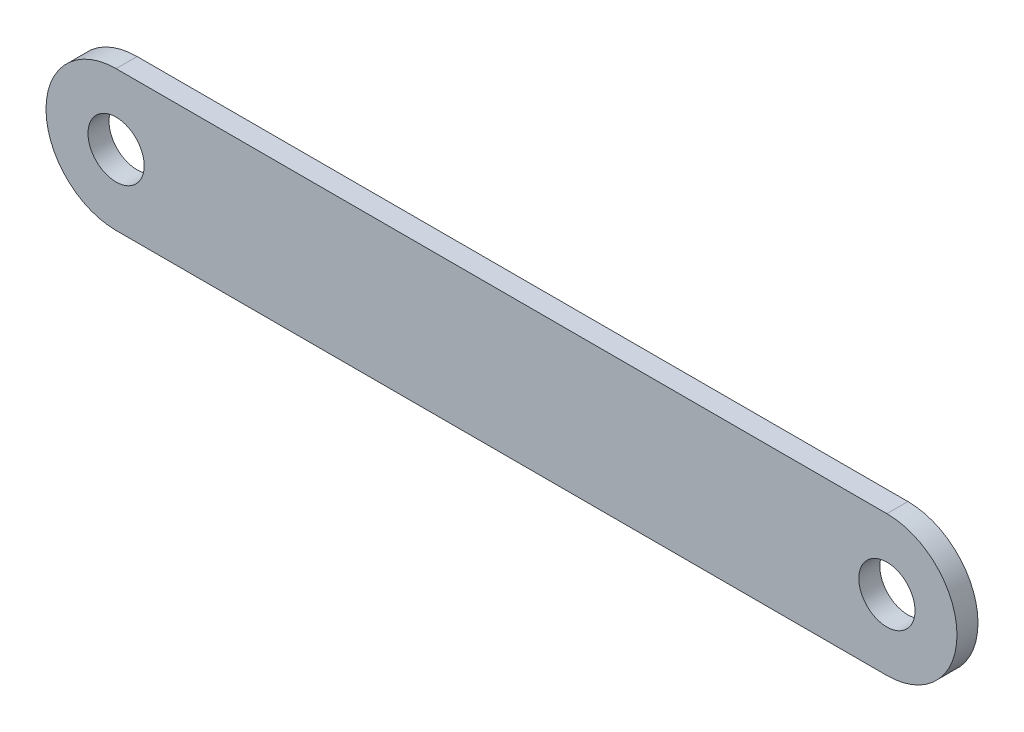
ISO-10303-21;
HEADER;
FILE_DESCRIPTION(('STEP AP214'),'2;1');
FILE_NAME('part.step','',(''),(''),'','','');
FILE_SCHEMA(('AUTOMOTIVE_DESIGN { 1 0 10303 214 1 1 1 1 }'));
ENDSEC;
DATA;
#1=APPLICATION_CONTEXT('core data for automotive mechanical design processes');
#2=APPLICATION_PROTOCOL_DEFINITION('international standard','automotive_design',2000,#1);
#3=PRODUCT_CONTEXT('',#1,'mechanical');
#4=PRODUCT('Part','Part','',(#3));
#5=PRODUCT_RELATED_PRODUCT_CATEGORY('part','',(#4));
#6=PRODUCT_DEFINITION_FORMATION('','',#4);
#7=PRODUCT_DEFINITION_CONTEXT('part definition',#1,'design');
#8=PRODUCT_DEFINITION('design','',#6,#7);
#9=PRODUCT_DEFINITION_SHAPE('','',#8);
#10=(LENGTH_UNIT() NAMED_UNIT(*) SI_UNIT(.MILLI.,.METRE.));
#11=(NAMED_UNIT(*) PLANE_ANGLE_UNIT() SI_UNIT($,.RADIAN.));
#12=(NAMED_UNIT(*) SI_UNIT($,.STERADIAN.) SOLID_ANGLE_UNIT());
#13=UNCERTAINTY_MEASURE_WITH_UNIT(LENGTH_MEASURE(1.E-05),#10,'distance_accuracy_value','');
#14=(GEOMETRIC_REPRESENTATION_CONTEXT(3) GLOBAL_UNCERTAINTY_ASSIGNED_CONTEXT((#13)) GLOBAL_UNIT_ASSIGNED_CONTEXT((#10,
#11,#12)) REPRESENTATION_CONTEXT('',''));
#15=CARTESIAN_POINT('',(0.,0.,0.));
#16=DIRECTION('',(0.,0.,1.));
#17=DIRECTION('',(1.,0.,0.));
#18=AXIS2_PLACEMENT_3D('',#15,#16,#17);
#19=CARTESIAN_POINT('',(0.,0.,3.));
#20=DIRECTION('',(0.,0.,-1.));
#21=DIRECTION('',(-1.,0.,0.));
#22=AXIS2_PLACEMENT_3D('',#19,#20,#21);
#23=CYLINDRICAL_SURFACE('',#22,10.);
#24=CARTESIAN_POINT('',(0.,0.,0.));
#25=DIRECTION('',(0.,0.,1.));
#26=DIRECTION('',(1.,0.,0.));
#27=AXIS2_PLACEMENT_3D('',#24,#25,#26);
#28=CIRCLE('',#27,10.);
#29=CARTESIAN_POINT('',(0.,10.,0.));
#30=VERTEX_POINT('',#29);
#31=CARTESIAN_POINT('',(0.,-10.,0.));
#32=VERTEX_POINT('',#31);
#33=EDGE_CURVE('E111',#30,#32,#28,.T.);
#34=ORIENTED_EDGE('',*,*,#33,.T.);
#35=DIRECTION('',(0.,0.,-1.));
#36=VECTOR('',#35,1.);
#37=CARTESIAN_POINT('',(0.,-10.,3.));
#38=LINE('',#37,#36);
#39=CARTESIAN_POINT('',(0.,-10.,3.));
#40=VERTEX_POINT('',#39);
#41=EDGE_CURVE('E46',#40,#32,#38,.T.);
#42=ORIENTED_EDGE('',*,*,#41,.F.);
#43=CARTESIAN_POINT('',(0.,0.,3.));
#44=DIRECTION('',(0.,0.,1.));
#45=DIRECTION('',(1.,0.,0.));
#46=AXIS2_PLACEMENT_3D('',#43,#44,#45);
#47=CIRCLE('',#46,10.);
#48=CARTESIAN_POINT('',(0.,10.,3.));
#49=VERTEX_POINT('',#48);
#50=EDGE_CURVE('E89',#49,#40,#47,.T.);
#51=ORIENTED_EDGE('',*,*,#50,.F.);
#52=DIRECTION('',(0.,0.,-1.));
#53=VECTOR('',#52,1.);
#54=CARTESIAN_POINT('',(0.,10.,3.));
#55=LINE('',#54,#53);
#56=EDGE_CURVE('E54',#49,#30,#55,.T.);
#57=ORIENTED_EDGE('',*,*,#56,.T.);
#58=EDGE_LOOP('',(#34,#42,#51,#57));
#59=FACE_BOUND('',#58,.T.);
#60=ADVANCED_FACE('F37',(#59),#23,.T.);
#61=CARTESIAN_POINT('',(0.,-10.,3.));
#62=DIRECTION('',(0.,1.,0.));
#63=DIRECTION('',(0.,0.,1.));
#64=AXIS2_PLACEMENT_3D('',#61,#62,#63);
#65=PLANE('',#64);
#66=DIRECTION('',(1.,0.,0.));
#67=VECTOR('',#66,1.);
#68=CARTESIAN_POINT('',(0.,-10.,0.));
#69=LINE('',#68,#67);
#70=CARTESIAN_POINT('',(110.,-10.0000000000639,0.));
#71=VERTEX_POINT('',#70);
#72=EDGE_CURVE('E95',#32,#71,#69,.T.);
#73=ORIENTED_EDGE('',*,*,#72,.T.);
#74=DIRECTION('',(0.,0.,-1.));
#75=VECTOR('',#74,1.);
#76=CARTESIAN_POINT('',(110.,-10.0000000000639,3.));
#77=LINE('',#76,#75);
#78=CARTESIAN_POINT('',(110.,-10.0000000000639,3.));
#79=VERTEX_POINT('',#78);
#80=EDGE_CURVE('E93',#79,#71,#77,.T.);
#81=ORIENTED_EDGE('',*,*,#80,.F.);
#82=DIRECTION('',(1.,0.,0.));
#83=VECTOR('',#82,1.);
#84=CARTESIAN_POINT('',(0.,-10.,3.));
#85=LINE('',#84,#83);
#86=EDGE_CURVE('E81',#40,#79,#85,.T.);
#87=ORIENTED_EDGE('',*,*,#86,.F.);
#88=ORIENTED_EDGE('',*,*,#41,.T.);
#89=EDGE_LOOP('',(#73,#81,#87,#88));
#90=FACE_BOUND('',#89,.T.);
#91=ADVANCED_FACE('F94',(#90),#65,.F.);
#92=CARTESIAN_POINT('',(110.,-6.38881308967498E-11,3.));
#93=DIRECTION('',(0.,0.,-1.));
#94=DIRECTION('',(-1.,0.,0.));
#95=AXIS2_PLACEMENT_3D('',#92,#93,#94);
#96=CYLINDRICAL_SURFACE('',#95,10.0000000000639);
#97=CARTESIAN_POINT('',(110.,-6.38881308967498E-11,0.));
#98=DIRECTION('',(0.,0.,1.));
#99=DIRECTION('',(1.,0.,0.));
#100=AXIS2_PLACEMENT_3D('',#97,#98,#99);
#101=CIRCLE('',#100,10.0000000000639);
#102=CARTESIAN_POINT('',(110.,10.,0.));
#103=VERTEX_POINT('',#102);
#104=EDGE_CURVE('E115',#71,#103,#101,.T.);
#105=ORIENTED_EDGE('',*,*,#104,.T.);
#106=DIRECTION('',(0.,0.,-1.));
#107=VECTOR('',#106,1.);
#108=CARTESIAN_POINT('',(110.,10.,3.));
#109=LINE('',#108,#107);
#110=CARTESIAN_POINT('',(110.,10.,3.));
#111=VERTEX_POINT('',#110);
#112=EDGE_CURVE('E69',#111,#103,#109,.T.);
#113=ORIENTED_EDGE('',*,*,#112,.F.);
#114=CARTESIAN_POINT('',(110.,-6.38881308967498E-11,3.));
#115=DIRECTION('',(0.,0.,1.));
#116=DIRECTION('',(1.,0.,0.));
#117=AXIS2_PLACEMENT_3D('',#114,#115,#116);
#118=CIRCLE('',#117,10.0000000000639);
#119=EDGE_CURVE('E88',#79,#111,#118,.T.);
#120=ORIENTED_EDGE('',*,*,#119,.F.);
#121=ORIENTED_EDGE('',*,*,#80,.T.);
#122=EDGE_LOOP('',(#105,#113,#120,#121));
#123=FACE_BOUND('',#122,.T.);
#124=ADVANCED_FACE('F99',(#123),#96,.T.);
#125=CARTESIAN_POINT('',(0.,10.,3.));
#126=DIRECTION('',(0.,1.,0.));
#127=DIRECTION('',(-1.,0.,0.));
#128=AXIS2_PLACEMENT_3D('',#125,#126,#127);
#129=PLANE('',#128);
#130=DIRECTION('',(1.,0.,0.));
#131=VECTOR('',#130,1.);
#132=CARTESIAN_POINT('',(0.,10.,0.));
#133=LINE('',#132,#131);
#134=EDGE_CURVE('E117',#30,#103,#133,.T.);
#135=ORIENTED_EDGE('',*,*,#134,.F.);
#136=ORIENTED_EDGE('',*,*,#56,.F.);
#137=DIRECTION('',(1.,0.,0.));
#138=VECTOR('',#137,1.);
#139=CARTESIAN_POINT('',(0.,10.,3.));
#140=LINE('',#139,#138);
#141=EDGE_CURVE('E100',#49,#111,#140,.T.);
#142=ORIENTED_EDGE('',*,*,#141,.T.);
#143=ORIENTED_EDGE('',*,*,#112,.T.);
#144=EDGE_LOOP('',(#135,#136,#142,#143));
#145=FACE_BOUND('',#144,.T.);
#146=ADVANCED_FACE('F128',(#145),#129,.T.);
#147=CARTESIAN_POINT('',(0.,0.,3.));
#148=DIRECTION('',(0.,0.,-1.));
#149=DIRECTION('',(-1.,0.,0.));
#150=AXIS2_PLACEMENT_3D('',#147,#148,#149);
#151=CYLINDRICAL_SURFACE('',#150,4.01);
#152=CARTESIAN_POINT('',(0.,0.,3.));
#153=DIRECTION('',(0.,0.,1.));
#154=DIRECTION('',(1.,0.,0.));
#155=AXIS2_PLACEMENT_3D('',#152,#153,#154);
#156=CIRCLE('',#155,4.01);
#157=CARTESIAN_POINT('',(4.01,0.,3.));
#158=VERTEX_POINT('',#157);
#159=EDGE_CURVE('E123',#158,#158,#156,.T.);
#160=ORIENTED_EDGE('',*,*,#159,.T.);
#161=EDGE_LOOP('',(#160));
#162=FACE_BOUND('',#161,.T.);
#163=CARTESIAN_POINT('',(0.,0.,0.));
#164=DIRECTION('',(0.,0.,1.));
#165=DIRECTION('',(1.,0.,0.));
#166=AXIS2_PLACEMENT_3D('',#163,#164,#165);
#167=CIRCLE('',#166,4.01);
#168=CARTESIAN_POINT('',(4.01,0.,0.));
#169=VERTEX_POINT('',#168);
#170=EDGE_CURVE('E108',#169,#169,#167,.T.);
#171=ORIENTED_EDGE('',*,*,#170,.F.);
#172=EDGE_LOOP('',(#171));
#173=FACE_BOUND('',#172,.T.);
#174=ADVANCED_FACE('F39',(#162,#173),#151,.F.);
#175=CARTESIAN_POINT('',(110.,-6.38881308967498E-11,3.));
#176=DIRECTION('',(0.,0.,-1.));
#177=DIRECTION('',(-1.,0.,0.));
#178=AXIS2_PLACEMENT_3D('',#175,#176,#177);
#179=CYLINDRICAL_SURFACE('',#178,4.01);
#180=CARTESIAN_POINT('',(110.,-6.38881308967498E-11,3.));
#181=DIRECTION('',(0.,0.,1.));
#182=DIRECTION('',(1.,0.,0.));
#183=AXIS2_PLACEMENT_3D('',#180,#181,#182);
#184=CIRCLE('',#183,4.01);
#185=CARTESIAN_POINT('',(114.01,-6.38881308967498E-11,3.));
#186=VERTEX_POINT('',#185);
#187=EDGE_CURVE('E102',#186,#186,#184,.T.);
#188=ORIENTED_EDGE('',*,*,#187,.T.);
#189=EDGE_LOOP('',(#188));
#190=FACE_BOUND('',#189,.T.);
#191=CARTESIAN_POINT('',(110.,-6.38881308967498E-11,0.));
#192=DIRECTION('',(0.,0.,1.));
#193=DIRECTION('',(1.,0.,0.));
#194=AXIS2_PLACEMENT_3D('',#191,#192,#193);
#195=CIRCLE('',#194,4.01);
#196=CARTESIAN_POINT('',(114.01,-6.38881308967498E-11,0.));
#197=VERTEX_POINT('',#196);
#198=EDGE_CURVE('E120',#197,#197,#195,.T.);
#199=ORIENTED_EDGE('',*,*,#198,.F.);
#200=EDGE_LOOP('',(#199));
#201=FACE_BOUND('',#200,.T.);
#202=ADVANCED_FACE('F135',(#190,#201),#179,.F.);
#203=CARTESIAN_POINT('',(0.,0.,3.));
#204=DIRECTION('',(0.,0.,1.));
#205=DIRECTION('',(1.,0.,0.));
#206=AXIS2_PLACEMENT_3D('',#203,#204,#205);
#207=PLANE('',#206);
#208=ORIENTED_EDGE('',*,*,#159,.F.);
#209=EDGE_LOOP('',(#208));
#210=FACE_BOUND('',#209,.T.);
#211=ORIENTED_EDGE('',*,*,#50,.T.);
#212=ORIENTED_EDGE('',*,*,#86,.T.);
#213=ORIENTED_EDGE('',*,*,#119,.T.);
#214=ORIENTED_EDGE('',*,*,#141,.F.);
#215=EDGE_LOOP('',(#211,#212,#213,#214));
#216=FACE_BOUND('',#215,.T.);
#217=ORIENTED_EDGE('',*,*,#187,.F.);
#218=EDGE_LOOP('',(#217));
#219=FACE_BOUND('',#218,.T.);
#220=ADVANCED_FACE('F84',(#210,#216,#219),#207,.T.);
#221=CARTESIAN_POINT('',(0.,0.,0.));
#222=DIRECTION('',(0.,0.,1.));
#223=DIRECTION('',(1.,0.,0.));
#224=AXIS2_PLACEMENT_3D('',#221,#222,#223);
#225=PLANE('',#224);
#226=CARTESIAN_POINT('',(20.,0.,0.));
#227=DIRECTION('',(0.,0.,1.));
#228=DIRECTION('',(1.,0.,0.));
#229=AXIS2_PLACEMENT_3D('',#226,#227,#228);
#230=CIRCLE('',#229,1.49);
#231=CARTESIAN_POINT('',(21.49,0.,0.));
#232=VERTEX_POINT('',#231);
#233=EDGE_CURVE('E11',#232,#232,#230,.F.);
#234=ORIENTED_EDGE('',*,*,#233,.F.);
#235=EDGE_LOOP('',(#234));
#236=FACE_BOUND('',#235,.T.);
#237=ORIENTED_EDGE('',*,*,#170,.T.);
#238=EDGE_LOOP('',(#237));
#239=FACE_BOUND('',#238,.T.);
#240=ORIENTED_EDGE('',*,*,#33,.F.);
#241=ORIENTED_EDGE('',*,*,#134,.T.);
#242=ORIENTED_EDGE('',*,*,#104,.F.);
#243=ORIENTED_EDGE('',*,*,#72,.F.);
#244=EDGE_LOOP('',(#240,#241,#242,#243));
#245=FACE_BOUND('',#244,.T.);
#246=ORIENTED_EDGE('',*,*,#198,.T.);
#247=EDGE_LOOP('',(#246));
#248=FACE_BOUND('',#247,.T.);
#249=ADVANCED_FACE('F126',(#236,#239,#245,#248),#225,.F.);
#250=CARTESIAN_POINT('',(20.,0.,-4.));
#251=DIRECTION('',(0.,0.,1.));
#252=DIRECTION('',(1.,0.,0.));
#253=AXIS2_PLACEMENT_3D('',#250,#251,#252);
#254=CYLINDRICAL_SURFACE('',#253,1.49);
#255=CARTESIAN_POINT('',(20.,0.,-4.));
#256=DIRECTION('',(0.,0.,-1.));
#257=DIRECTION('',(-1.,0.,0.));
#258=AXIS2_PLACEMENT_3D('',#255,#256,#257);
#259=CIRCLE('',#258,1.49);
#260=CARTESIAN_POINT('',(18.51,0.,-4.));
#261=VERTEX_POINT('',#260);
#262=EDGE_CURVE('E112',#261,#261,#259,.T.);
#263=ORIENTED_EDGE('',*,*,#262,.F.);
#264=EDGE_LOOP('',(#263));
#265=FACE_BOUND('',#264,.T.);
#266=ORIENTED_EDGE('',*,*,#233,.T.);
#267=EDGE_LOOP('',(#266));
#268=FACE_BOUND('',#267,.T.);
#269=ADVANCED_FACE('F189',(#265,#268),#254,.T.);
#270=CARTESIAN_POINT('',(20.,0.,-4.));
#271=DIRECTION('',(0.,0.,-1.));
#272=DIRECTION('',(-1.,0.,0.));
#273=AXIS2_PLACEMENT_3D('',#270,#271,#272);
#274=PLANE('',#273);
#275=ORIENTED_EDGE('',*,*,#262,.T.);
#276=EDGE_LOOP('',(#275));
#277=FACE_BOUND('',#276,.T.);
#278=ADVANCED_FACE('F200',(#277),#274,.T.);
#279=CLOSED_SHELL('',(#60,#91,#124,#146,#174,#202,#220,#249,#269,#278));
#280=MANIFOLD_SOLID_BREP('B2',#279);
#281=ADVANCED_BREP_SHAPE_REPRESENTATION('',(#18,#280),#14);
#282=SHAPE_DEFINITION_REPRESENTATION(#9,#281);
ENDSEC;
END-ISO-10303-21;
